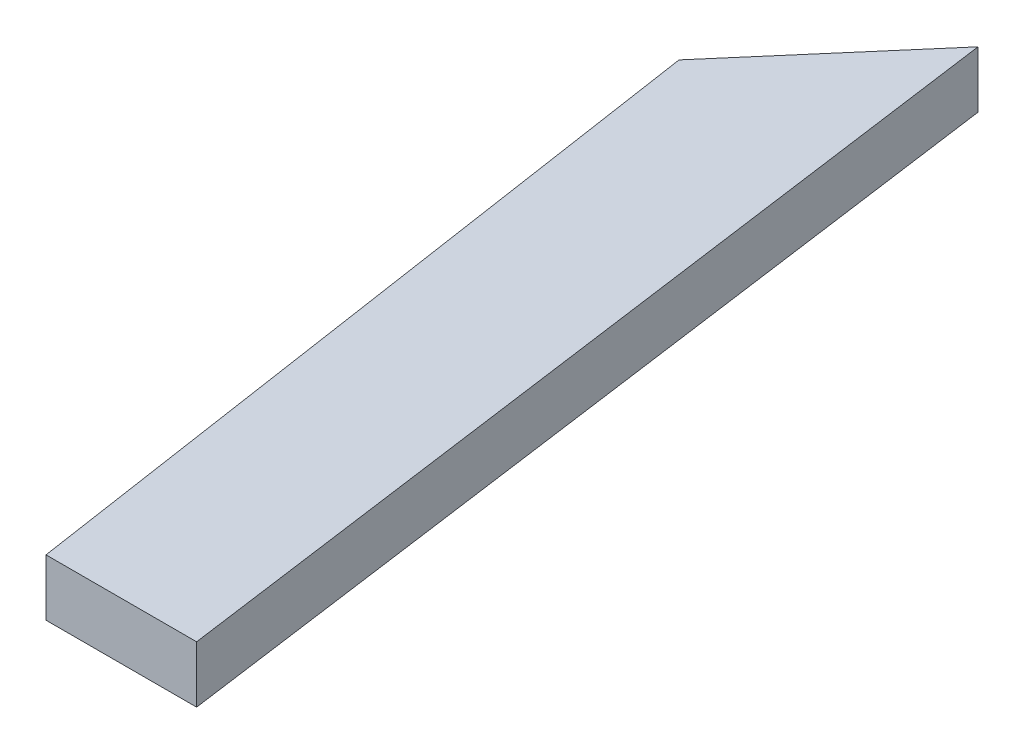
ISO-10303-21;
HEADER;
FILE_DESCRIPTION(('STEP AP214'),'2;1');
FILE_NAME('part.step','',(''),(''),'','','');
FILE_SCHEMA(('AUTOMOTIVE_DESIGN { 1 0 10303 214 1 1 1 1 }'));
ENDSEC;
DATA;
#1=APPLICATION_CONTEXT('core data for automotive mechanical design processes');
#2=APPLICATION_PROTOCOL_DEFINITION('international standard','automotive_design',2000,#1);
#3=PRODUCT_CONTEXT('',#1,'mechanical');
#4=PRODUCT('Part','Part','',(#3));
#5=PRODUCT_RELATED_PRODUCT_CATEGORY('part','',(#4));
#6=PRODUCT_DEFINITION_FORMATION('','',#4);
#7=PRODUCT_DEFINITION_CONTEXT('part definition',#1,'design');
#8=PRODUCT_DEFINITION('design','',#6,#7);
#9=PRODUCT_DEFINITION_SHAPE('','',#8);
#10=(LENGTH_UNIT() NAMED_UNIT(*) SI_UNIT(.MILLI.,.METRE.));
#11=(NAMED_UNIT(*) PLANE_ANGLE_UNIT() SI_UNIT($,.RADIAN.));
#12=(NAMED_UNIT(*) SI_UNIT($,.STERADIAN.) SOLID_ANGLE_UNIT());
#13=UNCERTAINTY_MEASURE_WITH_UNIT(LENGTH_MEASURE(1.E-05),#10,'distance_accuracy_value','');
#14=(GEOMETRIC_REPRESENTATION_CONTEXT(3) GLOBAL_UNCERTAINTY_ASSIGNED_CONTEXT((#13)) GLOBAL_UNIT_ASSIGNED_CONTEXT((#10,
#11,#12)) REPRESENTATION_CONTEXT('',''));
#15=CARTESIAN_POINT('',(0.,0.,0.));
#16=DIRECTION('',(0.,0.,1.));
#17=DIRECTION('',(1.,0.,0.));
#18=AXIS2_PLACEMENT_3D('',#15,#16,#17);
#19=CARTESIAN_POINT('',(0.,12.7,0.));
#20=DIRECTION('',(0.988870114819396,0.,-0.148781369858845));
#21=DIRECTION('',(-0.148781369858845,0.,-0.988870114819396));
#22=AXIS2_PLACEMENT_3D('',#19,#20,#21);
#23=PLANE('',#22);
#24=DIRECTION('',(0.148781369858845,0.,0.988870114819396));
#25=VECTOR('',#24,1.);
#26=CARTESIAN_POINT('',(0.,0.,0.));
#27=LINE('',#26,#25);
#28=CARTESIAN_POINT('',(-25.146,0.,-167.132));
#29=VERTEX_POINT('',#28);
#30=CARTESIAN_POINT('',(0.,0.,0.));
#31=VERTEX_POINT('',#30);
#32=EDGE_CURVE('E96',#29,#31,#27,.T.);
#33=ORIENTED_EDGE('',*,*,#32,.T.);
#34=DIRECTION('',(0.,-1.,0.));
#35=VECTOR('',#34,1.);
#36=CARTESIAN_POINT('',(0.,12.7,0.));
#37=LINE('',#36,#35);
#38=CARTESIAN_POINT('',(0.,12.7,0.));
#39=VERTEX_POINT('',#38);
#40=EDGE_CURVE('E11',#39,#31,#37,.T.);
#41=ORIENTED_EDGE('',*,*,#40,.F.);
#42=DIRECTION('',(0.148781369858845,0.,0.988870114819396));
#43=VECTOR('',#42,1.);
#44=CARTESIAN_POINT('',(0.,12.7,0.));
#45=LINE('',#44,#43);
#46=CARTESIAN_POINT('',(-25.146,12.7,-167.132));
#47=VERTEX_POINT('',#46);
#48=EDGE_CURVE('E84',#47,#39,#45,.T.);
#49=ORIENTED_EDGE('',*,*,#48,.F.);
#50=DIRECTION('',(0.,-1.,0.));
#51=VECTOR('',#50,1.);
#52=CARTESIAN_POINT('',(-25.146,12.7,-167.132));
#53=LINE('',#52,#51);
#54=EDGE_CURVE('E92',#47,#29,#53,.T.);
#55=ORIENTED_EDGE('',*,*,#54,.T.);
#56=EDGE_LOOP('',(#33,#41,#49,#55));
#57=FACE_BOUND('',#56,.T.);
#58=ADVANCED_FACE('F33',(#57),#23,.F.);
#59=CARTESIAN_POINT('',(0.,12.7,0.));
#60=DIRECTION('',(0.,0.,-1.));
#61=DIRECTION('',(-1.,0.,0.));
#62=AXIS2_PLACEMENT_3D('',#59,#60,#61);
#63=PLANE('',#62);
#64=DIRECTION('',(1.,0.,0.));
#65=VECTOR('',#64,1.);
#66=CARTESIAN_POINT('',(0.,0.,0.));
#67=LINE('',#66,#65);
#68=CARTESIAN_POINT('',(33.782,0.,0.));
#69=VERTEX_POINT('',#68);
#70=EDGE_CURVE('E88',#31,#69,#67,.T.);
#71=ORIENTED_EDGE('',*,*,#70,.T.);
#72=DIRECTION('',(0.,-1.,0.));
#73=VECTOR('',#72,1.);
#74=CARTESIAN_POINT('',(33.782,12.7,0.));
#75=LINE('',#74,#73);
#76=CARTESIAN_POINT('',(33.782,12.7,0.));
#77=VERTEX_POINT('',#76);
#78=EDGE_CURVE('E41',#77,#69,#75,.T.);
#79=ORIENTED_EDGE('',*,*,#78,.F.);
#80=DIRECTION('',(1.,0.,0.));
#81=VECTOR('',#80,1.);
#82=CARTESIAN_POINT('',(0.,12.7,0.));
#83=LINE('',#82,#81);
#84=EDGE_CURVE('E79',#39,#77,#83,.T.);
#85=ORIENTED_EDGE('',*,*,#84,.F.);
#86=ORIENTED_EDGE('',*,*,#40,.T.);
#87=EDGE_LOOP('',(#71,#79,#85,#86));
#88=FACE_BOUND('',#87,.T.);
#89=ADVANCED_FACE('F87',(#88),#63,.F.);
#90=CARTESIAN_POINT('',(33.782,12.7,0.));
#91=DIRECTION('',(-0.990678839845296,0.,0.136218340478728));
#92=DIRECTION('',(0.136218340478728,0.,0.990678839845296));
#93=AXIS2_PLACEMENT_3D('',#90,#91,#92);
#94=PLANE('',#93);
#95=DIRECTION('',(-0.136218340478728,0.,-0.990678839845296));
#96=VECTOR('',#95,1.);
#97=CARTESIAN_POINT('',(33.782,0.,0.));
#98=LINE('',#97,#96);
#99=CARTESIAN_POINT('',(5.84199999999997,0.,-203.2));
#100=VERTEX_POINT('',#99);
#101=EDGE_CURVE('E66',#69,#100,#98,.T.);
#102=ORIENTED_EDGE('',*,*,#101,.T.);
#103=DIRECTION('',(0.,-1.,0.));
#104=VECTOR('',#103,1.);
#105=CARTESIAN_POINT('',(5.84199999999997,12.7,-203.2));
#106=LINE('',#105,#104);
#107=CARTESIAN_POINT('',(5.84199999999997,12.7,-203.2));
#108=VERTEX_POINT('',#107);
#109=EDGE_CURVE('E89',#108,#100,#106,.T.);
#110=ORIENTED_EDGE('',*,*,#109,.F.);
#111=DIRECTION('',(-0.136218340478728,0.,-0.990678839845296));
#112=VECTOR('',#111,1.);
#113=CARTESIAN_POINT('',(33.782,12.7,0.));
#114=LINE('',#113,#112);
#115=EDGE_CURVE('E82',#77,#108,#114,.T.);
#116=ORIENTED_EDGE('',*,*,#115,.F.);
#117=ORIENTED_EDGE('',*,*,#78,.T.);
#118=EDGE_LOOP('',(#102,#110,#116,#117));
#119=FACE_BOUND('',#118,.T.);
#120=ADVANCED_FACE('F90',(#119),#94,.F.);
#121=CARTESIAN_POINT('',(-25.146,12.7,-167.132));
#122=DIRECTION('',(0.758501989584475,0.,0.651670723445816));
#123=DIRECTION('',(0.651670723445816,0.,-0.758501989584475));
#124=AXIS2_PLACEMENT_3D('',#121,#122,#123);
#125=PLANE('',#124);
#126=DIRECTION('',(-0.651670723445816,0.,0.758501989584475));
#127=VECTOR('',#126,1.);
#128=CARTESIAN_POINT('',(-25.146,0.,-167.132));
#129=LINE('',#128,#127);
#130=EDGE_CURVE('E72',#100,#29,#129,.T.);
#131=ORIENTED_EDGE('',*,*,#130,.T.);
#132=ORIENTED_EDGE('',*,*,#54,.F.);
#133=DIRECTION('',(-0.651670723445816,0.,0.758501989584475));
#134=VECTOR('',#133,1.);
#135=CARTESIAN_POINT('',(-25.146,12.7,-167.132));
#136=LINE('',#135,#134);
#137=EDGE_CURVE('E49',#108,#47,#136,.T.);
#138=ORIENTED_EDGE('',*,*,#137,.F.);
#139=ORIENTED_EDGE('',*,*,#109,.T.);
#140=EDGE_LOOP('',(#131,#132,#138,#139));
#141=FACE_BOUND('',#140,.T.);
#142=ADVANCED_FACE('F103',(#141),#125,.F.);
#143=CARTESIAN_POINT('',(0.,12.7,0.));
#144=DIRECTION('',(0.,-1.,0.));
#145=DIRECTION('',(0.,0.,-1.));
#146=AXIS2_PLACEMENT_3D('',#143,#144,#145);
#147=PLANE('',#146);
#148=ORIENTED_EDGE('',*,*,#48,.T.);
#149=ORIENTED_EDGE('',*,*,#84,.T.);
#150=ORIENTED_EDGE('',*,*,#115,.T.);
#151=ORIENTED_EDGE('',*,*,#137,.T.);
#152=EDGE_LOOP('',(#148,#149,#150,#151));
#153=FACE_BOUND('',#152,.T.);
#154=ADVANCED_FACE('F80',(#153),#147,.F.);
#155=CARTESIAN_POINT('',(0.,0.,0.));
#156=DIRECTION('',(0.,-1.,0.));
#157=DIRECTION('',(0.,0.,-1.));
#158=AXIS2_PLACEMENT_3D('',#155,#156,#157);
#159=PLANE('',#158);
#160=ORIENTED_EDGE('',*,*,#32,.F.);
#161=ORIENTED_EDGE('',*,*,#130,.F.);
#162=ORIENTED_EDGE('',*,*,#101,.F.);
#163=ORIENTED_EDGE('',*,*,#70,.F.);
#164=EDGE_LOOP('',(#160,#161,#162,#163));
#165=FACE_BOUND('',#164,.T.);
#166=ADVANCED_FACE('F106',(#165),#159,.T.);
#167=CLOSED_SHELL('',(#58,#89,#120,#142,#154,#166));
#168=MANIFOLD_SOLID_BREP('B2',#167);
#169=ADVANCED_BREP_SHAPE_REPRESENTATION('',(#18,#168),#14);
#170=SHAPE_DEFINITION_REPRESENTATION(#9,#169);
ENDSEC;
END-ISO-10303-21;
